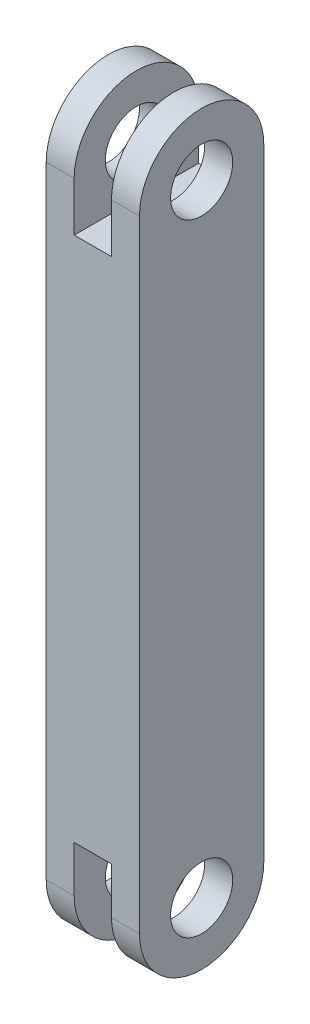
ISO-10303-21;
HEADER;
FILE_DESCRIPTION(('STEP AP214'),'2;1');
FILE_NAME('part.step','',(''),(''),'','','');
FILE_SCHEMA(('AUTOMOTIVE_DESIGN { 1 0 10303 214 1 1 1 1 }'));
ENDSEC;
DATA;
#1=APPLICATION_CONTEXT('core data for automotive mechanical design processes');
#2=APPLICATION_PROTOCOL_DEFINITION('international standard','automotive_design',2000,#1);
#3=PRODUCT_CONTEXT('',#1,'mechanical');
#4=PRODUCT('Part','Part','',(#3));
#5=PRODUCT_RELATED_PRODUCT_CATEGORY('part','',(#4));
#6=PRODUCT_DEFINITION_FORMATION('','',#4);
#7=PRODUCT_DEFINITION_CONTEXT('part definition',#1,'design');
#8=PRODUCT_DEFINITION('design','',#6,#7);
#9=PRODUCT_DEFINITION_SHAPE('','',#8);
#10=(LENGTH_UNIT() NAMED_UNIT(*) SI_UNIT(.MILLI.,.METRE.));
#11=(NAMED_UNIT(*) PLANE_ANGLE_UNIT() SI_UNIT($,.RADIAN.));
#12=(NAMED_UNIT(*) SI_UNIT($,.STERADIAN.) SOLID_ANGLE_UNIT());
#13=UNCERTAINTY_MEASURE_WITH_UNIT(LENGTH_MEASURE(1.E-05),#10,'distance_accuracy_value','');
#14=(GEOMETRIC_REPRESENTATION_CONTEXT(3) GLOBAL_UNCERTAINTY_ASSIGNED_CONTEXT((#13)) GLOBAL_UNIT_ASSIGNED_CONTEXT((#10,
#11,#12)) REPRESENTATION_CONTEXT('',''));
#15=CARTESIAN_POINT('',(0.,0.,0.));
#16=DIRECTION('',(0.,0.,1.));
#17=DIRECTION('',(1.,0.,0.));
#18=AXIS2_PLACEMENT_3D('',#15,#16,#17);
#19=CARTESIAN_POINT('',(9.525,0.,0.));
#20=DIRECTION('',(-1.,0.,0.));
#21=DIRECTION('',(0.,0.,1.));
#22=AXIS2_PLACEMENT_3D('',#19,#20,#21);
#23=CYLINDRICAL_SURFACE('',#22,12.7);
#24=DIRECTION('',(-1.,0.,0.));
#25=VECTOR('',#24,1.);
#26=CARTESIAN_POINT('',(9.525,0.,-12.7));
#27=LINE('',#26,#25);
#28=CARTESIAN_POINT('',(-3.80999999999998,0.,-12.7));
#29=VERTEX_POINT('',#28);
#30=CARTESIAN_POINT('',(-9.525,0.,-12.7));
#31=VERTEX_POINT('',#30);
#32=EDGE_CURVE('E214',#29,#31,#27,.T.);
#33=ORIENTED_EDGE('',*,*,#32,.F.);
#34=CARTESIAN_POINT('',(-3.80999999999998,0.,0.));
#35=DIRECTION('',(-1.,0.,0.));
#36=DIRECTION('',(0.,-1.,0.));
#37=AXIS2_PLACEMENT_3D('',#34,#35,#36);
#38=CIRCLE('',#37,12.7);
#39=CARTESIAN_POINT('',(-3.80999999999998,0.,12.7));
#40=VERTEX_POINT('',#39);
#41=EDGE_CURVE('E175',#29,#40,#38,.T.);
#42=ORIENTED_EDGE('',*,*,#41,.T.);
#43=DIRECTION('',(-1.,0.,0.));
#44=VECTOR('',#43,1.);
#45=CARTESIAN_POINT('',(9.525,0.,12.7));
#46=LINE('',#45,#44);
#47=CARTESIAN_POINT('',(-9.525,0.,12.7));
#48=VERTEX_POINT('',#47);
#49=EDGE_CURVE('E193',#40,#48,#46,.T.);
#50=ORIENTED_EDGE('',*,*,#49,.T.);
#51=CARTESIAN_POINT('',(-9.525,0.,0.));
#52=DIRECTION('',(1.,0.,0.));
#53=DIRECTION('',(0.,0.,-1.));
#54=AXIS2_PLACEMENT_3D('',#51,#52,#53);
#55=CIRCLE('',#54,12.7);
#56=EDGE_CURVE('E182',#48,#31,#55,.T.);
#57=ORIENTED_EDGE('',*,*,#56,.T.);
#58=EDGE_LOOP('',(#33,#42,#50,#57));
#59=FACE_BOUND('',#58,.T.);
#60=ADVANCED_FACE('F41',(#59),#23,.T.);
#61=CARTESIAN_POINT('',(9.525,127.,0.));
#62=DIRECTION('',(-1.,0.,0.));
#63=DIRECTION('',(0.,0.,1.));
#64=AXIS2_PLACEMENT_3D('',#61,#62,#63);
#65=CYLINDRICAL_SURFACE('',#64,12.7);
#66=DIRECTION('',(-1.,0.,0.));
#67=VECTOR('',#66,1.);
#68=CARTESIAN_POINT('',(9.525,127.,12.7));
#69=LINE('',#68,#67);
#70=CARTESIAN_POINT('',(-3.81,127.,12.7));
#71=VERTEX_POINT('',#70);
#72=CARTESIAN_POINT('',(-9.525,127.,12.7));
#73=VERTEX_POINT('',#72);
#74=EDGE_CURVE('E207',#71,#73,#69,.T.);
#75=ORIENTED_EDGE('',*,*,#74,.F.);
#76=CARTESIAN_POINT('',(-3.81,127.,0.));
#77=DIRECTION('',(-1.,0.,0.));
#78=DIRECTION('',(0.,0.,1.));
#79=AXIS2_PLACEMENT_3D('',#76,#77,#78);
#80=CIRCLE('',#79,12.7);
#81=CARTESIAN_POINT('',(-3.81,127.,-12.7));
#82=VERTEX_POINT('',#81);
#83=EDGE_CURVE('E179',#71,#82,#80,.T.);
#84=ORIENTED_EDGE('',*,*,#83,.T.);
#85=DIRECTION('',(-1.,0.,0.));
#86=VECTOR('',#85,1.);
#87=CARTESIAN_POINT('',(9.525,127.,-12.7));
#88=LINE('',#87,#86);
#89=CARTESIAN_POINT('',(-9.525,127.,-12.7));
#90=VERTEX_POINT('',#89);
#91=EDGE_CURVE('E211',#82,#90,#88,.T.);
#92=ORIENTED_EDGE('',*,*,#91,.T.);
#93=CARTESIAN_POINT('',(-9.525,127.,0.));
#94=DIRECTION('',(1.,0.,0.));
#95=DIRECTION('',(0.,0.,-1.));
#96=AXIS2_PLACEMENT_3D('',#93,#94,#95);
#97=CIRCLE('',#96,12.7);
#98=EDGE_CURVE('E199',#90,#73,#97,.T.);
#99=ORIENTED_EDGE('',*,*,#98,.T.);
#100=EDGE_LOOP('',(#75,#84,#92,#99));
#101=FACE_BOUND('',#100,.T.);
#102=ADVANCED_FACE('F271',(#101),#65,.T.);
#103=CARTESIAN_POINT('',(9.525,0.,12.7));
#104=VERTEX_POINT('',#103);
#105=CARTESIAN_POINT('',(3.81000000000002,0.,12.7));
#106=VERTEX_POINT('',#105);
#107=EDGE_CURVE('E204',#104,#106,#46,.T.);
#108=ORIENTED_EDGE('',*,*,#107,.T.);
#109=CARTESIAN_POINT('',(3.81000000000002,0.,0.));
#110=DIRECTION('',(1.,0.,0.));
#111=DIRECTION('',(0.,1.,0.));
#112=AXIS2_PLACEMENT_3D('',#109,#110,#111);
#113=CIRCLE('',#112,12.7);
#114=CARTESIAN_POINT('',(3.81000000000002,0.,-12.7));
#115=VERTEX_POINT('',#114);
#116=EDGE_CURVE('E66',#106,#115,#113,.T.);
#117=ORIENTED_EDGE('',*,*,#116,.T.);
#118=CARTESIAN_POINT('',(9.525,0.,-12.7));
#119=VERTEX_POINT('',#118);
#120=EDGE_CURVE('E215',#119,#115,#27,.T.);
#121=ORIENTED_EDGE('',*,*,#120,.F.);
#122=CARTESIAN_POINT('',(9.525,0.,0.));
#123=DIRECTION('',(1.,0.,0.));
#124=DIRECTION('',(0.,0.,-1.));
#125=AXIS2_PLACEMENT_3D('',#122,#123,#124);
#126=CIRCLE('',#125,12.7);
#127=EDGE_CURVE('E183',#104,#119,#126,.T.);
#128=ORIENTED_EDGE('',*,*,#127,.F.);
#129=EDGE_LOOP('',(#108,#117,#121,#128));
#130=FACE_BOUND('',#129,.T.);
#131=ADVANCED_FACE('F43',(#130),#23,.T.);
#132=CARTESIAN_POINT('',(9.525,0.,-12.7));
#133=DIRECTION('',(0.,0.,1.));
#134=DIRECTION('',(1.,0.,0.));
#135=AXIS2_PLACEMENT_3D('',#132,#133,#134);
#136=PLANE('',#135);
#137=ORIENTED_EDGE('',*,*,#91,.F.);
#138=DIRECTION('',(0.,-1.,0.));
#139=VECTOR('',#138,1.);
#140=CARTESIAN_POINT('',(-3.81,116.945260472718,-12.7));
#141=LINE('',#140,#139);
#142=CARTESIAN_POINT('',(-3.81,116.945260472718,-12.7));
#143=VERTEX_POINT('',#142);
#144=EDGE_CURVE('E139',#82,#143,#141,.T.);
#145=ORIENTED_EDGE('',*,*,#144,.T.);
#146=DIRECTION('',(1.,0.,0.));
#147=VECTOR('',#146,1.);
#148=CARTESIAN_POINT('',(3.81,116.945260472718,-12.7));
#149=LINE('',#148,#147);
#150=CARTESIAN_POINT('',(3.81,116.945260472718,-12.7));
#151=VERTEX_POINT('',#150);
#152=EDGE_CURVE('E134',#143,#151,#149,.T.);
#153=ORIENTED_EDGE('',*,*,#152,.T.);
#154=DIRECTION('',(0.,1.,0.));
#155=VECTOR('',#154,1.);
#156=CARTESIAN_POINT('',(3.81,147.087355687949,-12.7));
#157=LINE('',#156,#155);
#158=CARTESIAN_POINT('',(3.81,127.,-12.7));
#159=VERTEX_POINT('',#158);
#160=EDGE_CURVE('E142',#151,#159,#157,.T.);
#161=ORIENTED_EDGE('',*,*,#160,.T.);
#162=CARTESIAN_POINT('',(9.525,127.,-12.7));
#163=VERTEX_POINT('',#162);
#164=EDGE_CURVE('E212',#163,#159,#88,.T.);
#165=ORIENTED_EDGE('',*,*,#164,.F.);
#166=DIRECTION('',(0.,1.,0.));
#167=VECTOR('',#166,1.);
#168=CARTESIAN_POINT('',(9.525,0.,-12.7));
#169=LINE('',#168,#167);
#170=EDGE_CURVE('E186',#119,#163,#169,.T.);
#171=ORIENTED_EDGE('',*,*,#170,.F.);
#172=ORIENTED_EDGE('',*,*,#120,.T.);
#173=DIRECTION('',(0.,1.,0.));
#174=VECTOR('',#173,1.);
#175=CARTESIAN_POINT('',(3.81000000000002,9.46987362916911,-12.7));
#176=LINE('',#175,#174);
#177=CARTESIAN_POINT('',(3.81000000000002,9.46987362916911,-12.7));
#178=VERTEX_POINT('',#177);
#179=EDGE_CURVE('E152',#115,#178,#176,.T.);
#180=ORIENTED_EDGE('',*,*,#179,.T.);
#181=DIRECTION('',(-1.,0.,0.));
#182=VECTOR('',#181,1.);
#183=CARTESIAN_POINT('',(-3.80999999999998,9.46987362916911,-12.7));
#184=LINE('',#183,#182);
#185=CARTESIAN_POINT('',(-3.80999999999998,9.46987362916911,-12.7));
#186=VERTEX_POINT('',#185);
#187=EDGE_CURVE('E155',#178,#186,#184,.T.);
#188=ORIENTED_EDGE('',*,*,#187,.T.);
#189=DIRECTION('',(0.,-1.,0.));
#190=VECTOR('',#189,1.);
#191=CARTESIAN_POINT('',(-3.80999999999998,-20.6722215860618,-12.7));
#192=LINE('',#191,#190);
#193=EDGE_CURVE('E166',#186,#29,#192,.T.);
#194=ORIENTED_EDGE('',*,*,#193,.T.);
#195=ORIENTED_EDGE('',*,*,#32,.T.);
#196=DIRECTION('',(0.,1.,0.));
#197=VECTOR('',#196,1.);
#198=CARTESIAN_POINT('',(-9.525,0.,-12.7));
#199=LINE('',#198,#197);
#200=EDGE_CURVE('E196',#31,#90,#199,.T.);
#201=ORIENTED_EDGE('',*,*,#200,.T.);
#202=EDGE_LOOP('',(#137,#145,#153,#161,#165,#171,#172,#180,#188,#194,#195,#201));
#203=FACE_BOUND('',#202,.T.);
#204=ADVANCED_FACE('F151',(#203),#136,.F.);
#205=ORIENTED_EDGE('',*,*,#164,.T.);
#206=CARTESIAN_POINT('',(3.81,127.,0.));
#207=DIRECTION('',(1.,0.,0.));
#208=DIRECTION('',(0.,1.,0.));
#209=AXIS2_PLACEMENT_3D('',#206,#207,#208);
#210=CIRCLE('',#209,12.7);
#211=CARTESIAN_POINT('',(3.81,127.,12.7));
#212=VERTEX_POINT('',#211);
#213=EDGE_CURVE('E145',#159,#212,#210,.T.);
#214=ORIENTED_EDGE('',*,*,#213,.T.);
#215=CARTESIAN_POINT('',(9.525,127.,12.7));
#216=VERTEX_POINT('',#215);
#217=EDGE_CURVE('E208',#216,#212,#69,.T.);
#218=ORIENTED_EDGE('',*,*,#217,.F.);
#219=CARTESIAN_POINT('',(9.525,127.,0.));
#220=DIRECTION('',(1.,0.,0.));
#221=DIRECTION('',(0.,0.,-1.));
#222=AXIS2_PLACEMENT_3D('',#219,#220,#221);
#223=CIRCLE('',#222,12.7);
#224=EDGE_CURVE('E189',#163,#216,#223,.T.);
#225=ORIENTED_EDGE('',*,*,#224,.F.);
#226=EDGE_LOOP('',(#205,#214,#218,#225));
#227=FACE_BOUND('',#226,.T.);
#228=ADVANCED_FACE('F278',(#227),#65,.T.);
#229=CARTESIAN_POINT('',(9.525,0.,12.7));
#230=DIRECTION('',(0.,0.,-1.));
#231=DIRECTION('',(-1.,0.,0.));
#232=AXIS2_PLACEMENT_3D('',#229,#230,#231);
#233=PLANE('',#232);
#234=DIRECTION('',(-1.,0.,0.));
#235=VECTOR('',#234,1.);
#236=CARTESIAN_POINT('',(9.525,116.945260472718,12.7));
#237=LINE('',#236,#235);
#238=CARTESIAN_POINT('',(3.81,116.945260472718,12.7));
#239=VERTEX_POINT('',#238);
#240=CARTESIAN_POINT('',(-3.81,116.945260472718,12.7));
#241=VERTEX_POINT('',#240);
#242=EDGE_CURVE('E50',#239,#241,#237,.T.);
#243=ORIENTED_EDGE('',*,*,#242,.T.);
#244=DIRECTION('',(0.,1.,0.));
#245=VECTOR('',#244,1.);
#246=CARTESIAN_POINT('',(-3.81,0.,12.7));
#247=LINE('',#246,#245);
#248=EDGE_CURVE('E11',#241,#71,#247,.T.);
#249=ORIENTED_EDGE('',*,*,#248,.T.);
#250=ORIENTED_EDGE('',*,*,#74,.T.);
#251=DIRECTION('',(0.,-1.,0.));
#252=VECTOR('',#251,1.);
#253=CARTESIAN_POINT('',(-9.525,0.,12.7));
#254=LINE('',#253,#252);
#255=EDGE_CURVE('E187',#73,#48,#254,.T.);
#256=ORIENTED_EDGE('',*,*,#255,.T.);
#257=ORIENTED_EDGE('',*,*,#49,.F.);
#258=DIRECTION('',(0.,1.,0.));
#259=VECTOR('',#258,1.);
#260=CARTESIAN_POINT('',(-3.80999999999998,0.,12.7));
#261=LINE('',#260,#259);
#262=CARTESIAN_POINT('',(-3.80999999999998,9.46987362916911,12.7));
#263=VERTEX_POINT('',#262);
#264=EDGE_CURVE('E223',#40,#263,#261,.T.);
#265=ORIENTED_EDGE('',*,*,#264,.T.);
#266=DIRECTION('',(1.,0.,0.));
#267=VECTOR('',#266,1.);
#268=CARTESIAN_POINT('',(9.525,9.46987362916911,12.7));
#269=LINE('',#268,#267);
#270=CARTESIAN_POINT('',(3.81000000000002,9.46987362916911,12.7));
#271=VERTEX_POINT('',#270);
#272=EDGE_CURVE('E220',#263,#271,#269,.T.);
#273=ORIENTED_EDGE('',*,*,#272,.T.);
#274=DIRECTION('',(0.,-1.,0.));
#275=VECTOR('',#274,1.);
#276=CARTESIAN_POINT('',(3.81000000000002,0.,12.7));
#277=LINE('',#276,#275);
#278=EDGE_CURVE('E218',#271,#106,#277,.T.);
#279=ORIENTED_EDGE('',*,*,#278,.T.);
#280=ORIENTED_EDGE('',*,*,#107,.F.);
#281=DIRECTION('',(0.,-1.,0.));
#282=VECTOR('',#281,1.);
#283=CARTESIAN_POINT('',(9.525,0.,12.7));
#284=LINE('',#283,#282);
#285=EDGE_CURVE('E191',#216,#104,#284,.T.);
#286=ORIENTED_EDGE('',*,*,#285,.F.);
#287=ORIENTED_EDGE('',*,*,#217,.T.);
#288=DIRECTION('',(0.,-1.,0.));
#289=VECTOR('',#288,1.);
#290=CARTESIAN_POINT('',(3.81,0.,12.7));
#291=LINE('',#290,#289);
#292=EDGE_CURVE('E226',#212,#239,#291,.T.);
#293=ORIENTED_EDGE('',*,*,#292,.T.);
#294=EDGE_LOOP('',(#243,#249,#250,#256,#257,#265,#273,#279,#280,#286,#287,#293));
#295=FACE_BOUND('',#294,.T.);
#296=ADVANCED_FACE('F290',(#295),#233,.F.);
#297=CARTESIAN_POINT('',(9.525,0.,0.));
#298=DIRECTION('',(1.,0.,0.));
#299=DIRECTION('',(0.,0.,-1.));
#300=AXIS2_PLACEMENT_3D('',#297,#298,#299);
#301=PLANE('',#300);
#302=CARTESIAN_POINT('',(9.525,0.,0.));
#303=DIRECTION('',(1.,0.,0.));
#304=DIRECTION('',(0.,0.,-1.));
#305=AXIS2_PLACEMENT_3D('',#302,#303,#304);
#306=CIRCLE('',#305,6.35);
#307=CARTESIAN_POINT('',(9.525,0.,-6.35));
#308=VERTEX_POINT('',#307);
#309=EDGE_CURVE('E158',#308,#308,#306,.T.);
#310=ORIENTED_EDGE('',*,*,#309,.F.);
#311=EDGE_LOOP('',(#310));
#312=FACE_BOUND('',#311,.T.);
#313=CARTESIAN_POINT('',(9.525,127.,0.));
#314=DIRECTION('',(1.,0.,0.));
#315=DIRECTION('',(0.,0.,-1.));
#316=AXIS2_PLACEMENT_3D('',#313,#314,#315);
#317=CIRCLE('',#316,6.35);
#318=CARTESIAN_POINT('',(9.525,127.,-6.35));
#319=VERTEX_POINT('',#318);
#320=EDGE_CURVE('E235',#319,#319,#317,.T.);
#321=ORIENTED_EDGE('',*,*,#320,.F.);
#322=EDGE_LOOP('',(#321));
#323=FACE_BOUND('',#322,.T.);
#324=ORIENTED_EDGE('',*,*,#127,.T.);
#325=ORIENTED_EDGE('',*,*,#170,.T.);
#326=ORIENTED_EDGE('',*,*,#224,.T.);
#327=ORIENTED_EDGE('',*,*,#285,.T.);
#328=EDGE_LOOP('',(#324,#325,#326,#327));
#329=FACE_BOUND('',#328,.T.);
#330=ADVANCED_FACE('F297',(#312,#323,#329),#301,.T.);
#331=CARTESIAN_POINT('',(-9.525,0.,0.));
#332=DIRECTION('',(1.,0.,0.));
#333=DIRECTION('',(0.,0.,-1.));
#334=AXIS2_PLACEMENT_3D('',#331,#332,#333);
#335=PLANE('',#334);
#336=CARTESIAN_POINT('',(-9.525,0.,0.));
#337=DIRECTION('',(1.,0.,0.));
#338=DIRECTION('',(0.,0.,-1.));
#339=AXIS2_PLACEMENT_3D('',#336,#337,#338);
#340=CIRCLE('',#339,6.35);
#341=CARTESIAN_POINT('',(-9.525,0.,-6.35));
#342=VERTEX_POINT('',#341);
#343=EDGE_CURVE('E231',#342,#342,#340,.T.);
#344=ORIENTED_EDGE('',*,*,#343,.T.);
#345=EDGE_LOOP('',(#344));
#346=FACE_BOUND('',#345,.T.);
#347=CARTESIAN_POINT('',(-9.525,127.,0.));
#348=DIRECTION('',(1.,0.,0.));
#349=DIRECTION('',(0.,0.,-1.));
#350=AXIS2_PLACEMENT_3D('',#347,#348,#349);
#351=CIRCLE('',#350,6.35);
#352=CARTESIAN_POINT('',(-9.525,127.,-6.35));
#353=VERTEX_POINT('',#352);
#354=EDGE_CURVE('E238',#353,#353,#351,.T.);
#355=ORIENTED_EDGE('',*,*,#354,.T.);
#356=EDGE_LOOP('',(#355));
#357=FACE_BOUND('',#356,.T.);
#358=ORIENTED_EDGE('',*,*,#56,.F.);
#359=ORIENTED_EDGE('',*,*,#255,.F.);
#360=ORIENTED_EDGE('',*,*,#98,.F.);
#361=ORIENTED_EDGE('',*,*,#200,.F.);
#362=EDGE_LOOP('',(#358,#359,#360,#361));
#363=FACE_BOUND('',#362,.T.);
#364=ADVANCED_FACE('F307',(#346,#357,#363),#335,.F.);
#365=CARTESIAN_POINT('',(-3.80999999999998,-20.6722215860618,-12.7));
#366=DIRECTION('',(-1.,0.,0.));
#367=DIRECTION('',(0.,-1.,0.));
#368=AXIS2_PLACEMENT_3D('',#365,#366,#367);
#369=PLANE('',#368);
#370=CARTESIAN_POINT('',(-3.80999999999998,0.,0.));
#371=DIRECTION('',(-1.,0.,0.));
#372=DIRECTION('',(0.,-1.,0.));
#373=AXIS2_PLACEMENT_3D('',#370,#371,#372);
#374=CIRCLE('',#373,6.35);
#375=CARTESIAN_POINT('',(-3.80999999999998,0.,-6.35));
#376=VERTEX_POINT('',#375);
#377=EDGE_CURVE('E246',#376,#376,#374,.T.);
#378=ORIENTED_EDGE('',*,*,#377,.T.);
#379=EDGE_LOOP('',(#378));
#380=FACE_BOUND('',#379,.T.);
#381=ORIENTED_EDGE('',*,*,#193,.F.);
#382=DIRECTION('',(0.,0.,1.));
#383=VECTOR('',#382,1.);
#384=CARTESIAN_POINT('',(-3.80999999999998,9.46987362916911,-12.7));
#385=LINE('',#384,#383);
#386=EDGE_CURVE('E167',#186,#263,#385,.T.);
#387=ORIENTED_EDGE('',*,*,#386,.T.);
#388=ORIENTED_EDGE('',*,*,#264,.F.);
#389=ORIENTED_EDGE('',*,*,#41,.F.);
#390=EDGE_LOOP('',(#381,#387,#388,#389));
#391=FACE_BOUND('',#390,.T.);
#392=ADVANCED_FACE('F310',(#380,#391),#369,.F.);
#393=CARTESIAN_POINT('',(-3.80999999999998,9.46987362916911,-12.7));
#394=DIRECTION('',(0.,1.,0.));
#395=DIRECTION('',(0.,0.,1.));
#396=AXIS2_PLACEMENT_3D('',#393,#394,#395);
#397=PLANE('',#396);
#398=ORIENTED_EDGE('',*,*,#386,.F.);
#399=ORIENTED_EDGE('',*,*,#187,.F.);
#400=DIRECTION('',(0.,0.,1.));
#401=VECTOR('',#400,1.);
#402=CARTESIAN_POINT('',(3.81000000000002,9.46987362916911,-12.7));
#403=LINE('',#402,#401);
#404=EDGE_CURVE('E163',#178,#271,#403,.T.);
#405=ORIENTED_EDGE('',*,*,#404,.T.);
#406=ORIENTED_EDGE('',*,*,#272,.F.);
#407=EDGE_LOOP('',(#398,#399,#405,#406));
#408=FACE_BOUND('',#407,.T.);
#409=ADVANCED_FACE('F293',(#408),#397,.F.);
#410=CARTESIAN_POINT('',(3.81000000000002,9.46987362916911,-12.7));
#411=DIRECTION('',(1.,0.,0.));
#412=DIRECTION('',(0.,1.,0.));
#413=AXIS2_PLACEMENT_3D('',#410,#411,#412);
#414=PLANE('',#413);
#415=CARTESIAN_POINT('',(3.81000000000002,0.,0.));
#416=DIRECTION('',(1.,0.,0.));
#417=DIRECTION('',(0.,1.,0.));
#418=AXIS2_PLACEMENT_3D('',#415,#416,#417);
#419=CIRCLE('',#418,6.35);
#420=CARTESIAN_POINT('',(3.81000000000002,0.,-6.35));
#421=VERTEX_POINT('',#420);
#422=EDGE_CURVE('E45',#421,#421,#419,.T.);
#423=ORIENTED_EDGE('',*,*,#422,.T.);
#424=EDGE_LOOP('',(#423));
#425=FACE_BOUND('',#424,.T.);
#426=ORIENTED_EDGE('',*,*,#278,.F.);
#427=ORIENTED_EDGE('',*,*,#404,.F.);
#428=ORIENTED_EDGE('',*,*,#179,.F.);
#429=ORIENTED_EDGE('',*,*,#116,.F.);
#430=EDGE_LOOP('',(#426,#427,#428,#429));
#431=FACE_BOUND('',#430,.T.);
#432=ADVANCED_FACE('F254',(#425,#431),#414,.F.);
#433=CARTESIAN_POINT('',(3.81,116.945260472718,-12.7));
#434=DIRECTION('',(0.,-1.,0.));
#435=DIRECTION('',(0.,0.,-1.));
#436=AXIS2_PLACEMENT_3D('',#433,#434,#435);
#437=PLANE('',#436);
#438=DIRECTION('',(0.,0.,1.));
#439=VECTOR('',#438,1.);
#440=CARTESIAN_POINT('',(3.81,116.945260472718,-12.7));
#441=LINE('',#440,#439);
#442=EDGE_CURVE('E58',#151,#239,#441,.T.);
#443=ORIENTED_EDGE('',*,*,#442,.F.);
#444=ORIENTED_EDGE('',*,*,#152,.F.);
#445=DIRECTION('',(0.,0.,1.));
#446=VECTOR('',#445,1.);
#447=CARTESIAN_POINT('',(-3.81,116.945260472718,-12.7));
#448=LINE('',#447,#446);
#449=EDGE_CURVE('E138',#143,#241,#448,.T.);
#450=ORIENTED_EDGE('',*,*,#449,.T.);
#451=ORIENTED_EDGE('',*,*,#242,.F.);
#452=EDGE_LOOP('',(#443,#444,#450,#451));
#453=FACE_BOUND('',#452,.T.);
#454=ADVANCED_FACE('F131',(#453),#437,.F.);
#455=CARTESIAN_POINT('',(-3.81,116.945260472718,-12.7));
#456=DIRECTION('',(-1.,0.,0.));
#457=DIRECTION('',(0.,0.,1.));
#458=AXIS2_PLACEMENT_3D('',#455,#456,#457);
#459=PLANE('',#458);
#460=CARTESIAN_POINT('',(-3.81,127.,0.));
#461=DIRECTION('',(-1.,0.,0.));
#462=DIRECTION('',(0.,0.,1.));
#463=AXIS2_PLACEMENT_3D('',#460,#461,#462);
#464=CIRCLE('',#463,6.35);
#465=CARTESIAN_POINT('',(-3.81,127.,-6.35));
#466=VERTEX_POINT('',#465);
#467=EDGE_CURVE('E230',#466,#466,#464,.T.);
#468=ORIENTED_EDGE('',*,*,#467,.T.);
#469=EDGE_LOOP('',(#468));
#470=FACE_BOUND('',#469,.T.);
#471=ORIENTED_EDGE('',*,*,#248,.F.);
#472=ORIENTED_EDGE('',*,*,#449,.F.);
#473=ORIENTED_EDGE('',*,*,#144,.F.);
#474=ORIENTED_EDGE('',*,*,#83,.F.);
#475=EDGE_LOOP('',(#471,#472,#473,#474));
#476=FACE_BOUND('',#475,.T.);
#477=ADVANCED_FACE('F349',(#470,#476),#459,.F.);
#478=CARTESIAN_POINT('',(3.81,147.087355687949,-12.7));
#479=DIRECTION('',(1.,0.,0.));
#480=DIRECTION('',(0.,1.,0.));
#481=AXIS2_PLACEMENT_3D('',#478,#479,#480);
#482=PLANE('',#481);
#483=CARTESIAN_POINT('',(3.81,127.,0.));
#484=DIRECTION('',(1.,0.,0.));
#485=DIRECTION('',(0.,1.,0.));
#486=AXIS2_PLACEMENT_3D('',#483,#484,#485);
#487=CIRCLE('',#486,6.35);
#488=CARTESIAN_POINT('',(3.81,127.,-6.35));
#489=VERTEX_POINT('',#488);
#490=EDGE_CURVE('E228',#489,#489,#487,.T.);
#491=ORIENTED_EDGE('',*,*,#490,.T.);
#492=EDGE_LOOP('',(#491));
#493=FACE_BOUND('',#492,.T.);
#494=ORIENTED_EDGE('',*,*,#160,.F.);
#495=ORIENTED_EDGE('',*,*,#442,.T.);
#496=ORIENTED_EDGE('',*,*,#292,.F.);
#497=ORIENTED_EDGE('',*,*,#213,.F.);
#498=EDGE_LOOP('',(#494,#495,#496,#497));
#499=FACE_BOUND('',#498,.T.);
#500=ADVANCED_FACE('F143',(#493,#499),#482,.F.);
#501=CARTESIAN_POINT('',(-9.525,127.,0.));
#502=DIRECTION('',(1.,0.,0.));
#503=DIRECTION('',(0.,0.,-1.));
#504=AXIS2_PLACEMENT_3D('',#501,#502,#503);
#505=CYLINDRICAL_SURFACE('',#504,6.35);
#506=CARTESIAN_POINT('',(9.525,127.,-6.35));
#507=CARTESIAN_POINT('',(9.46546875,127.,-6.35));
#508=CARTESIAN_POINT('',(9.4059375,127.,-6.35));
#509=CARTESIAN_POINT('',(9.286875,127.,-6.35));
#510=CARTESIAN_POINT('',(9.22734375,127.,-6.35));
#511=CARTESIAN_POINT('',(9.10828125,127.,-6.35));
#512=CARTESIAN_POINT('',(9.04875,127.,-6.35));
#513=CARTESIAN_POINT('',(8.9296875,127.,-6.35));
#514=CARTESIAN_POINT('',(8.87015625,127.,-6.35));
#515=CARTESIAN_POINT('',(8.75109375,127.,-6.35));
#516=CARTESIAN_POINT('',(8.6915625,127.,-6.35));
#517=CARTESIAN_POINT('',(8.5725,127.,-6.35));
#518=CARTESIAN_POINT('',(8.51296875,127.,-6.35));
#519=CARTESIAN_POINT('',(8.39390625,127.,-6.35));
#520=CARTESIAN_POINT('',(8.334375,127.,-6.35));
#521=CARTESIAN_POINT('',(8.2153125,127.,-6.35));
#522=CARTESIAN_POINT('',(8.15578125,127.,-6.35));
#523=CARTESIAN_POINT('',(8.03671875,127.,-6.35));
#524=CARTESIAN_POINT('',(7.9771875,127.,-6.35));
#525=CARTESIAN_POINT('',(7.858125,127.,-6.35));
#526=CARTESIAN_POINT('',(7.79859375,127.,-6.35));
#527=CARTESIAN_POINT('',(7.67953125,127.,-6.35));
#528=CARTESIAN_POINT('',(7.62,127.,-6.35));
#529=CARTESIAN_POINT('',(7.5009375,127.,-6.35));
#530=CARTESIAN_POINT('',(7.44140625,127.,-6.35));
#531=CARTESIAN_POINT('',(7.32234375,127.,-6.35));
#532=CARTESIAN_POINT('',(7.2628125,127.,-6.35));
#533=CARTESIAN_POINT('',(7.14375,127.,-6.35));
#534=CARTESIAN_POINT('',(7.08421875,127.,-6.35));
#535=CARTESIAN_POINT('',(6.96515625,127.,-6.35));
#536=CARTESIAN_POINT('',(6.905625,127.,-6.35));
#537=CARTESIAN_POINT('',(6.7865625,127.,-6.35));
#538=CARTESIAN_POINT('',(6.72703125,127.,-6.35));
#539=CARTESIAN_POINT('',(6.60796875,127.,-6.35));
#540=CARTESIAN_POINT('',(6.5484375,127.,-6.35));
#541=CARTESIAN_POINT('',(6.429375,127.,-6.35));
#542=CARTESIAN_POINT('',(6.36984375,127.,-6.35));
#543=CARTESIAN_POINT('',(6.25078125,127.,-6.35));
#544=CARTESIAN_POINT('',(6.19125,127.,-6.35));
#545=CARTESIAN_POINT('',(6.0721875,127.,-6.35));
#546=CARTESIAN_POINT('',(6.01265625,127.,-6.35));
#547=CARTESIAN_POINT('',(5.89359375,127.,-6.35));
#548=CARTESIAN_POINT('',(5.8340625,127.,-6.35));
#549=CARTESIAN_POINT('',(5.715,127.,-6.35));
#550=CARTESIAN_POINT('',(5.65546875,127.,-6.35));
#551=CARTESIAN_POINT('',(5.53640625,127.,-6.35));
#552=CARTESIAN_POINT('',(5.476875,127.,-6.35));
#553=CARTESIAN_POINT('',(5.3578125,127.,-6.35));
#554=CARTESIAN_POINT('',(5.29828125,127.,-6.35));
#555=CARTESIAN_POINT('',(5.17921875,127.,-6.35));
#556=CARTESIAN_POINT('',(5.1196875,127.,-6.35));
#557=CARTESIAN_POINT('',(5.000625,127.,-6.35));
#558=CARTESIAN_POINT('',(4.94109375,127.,-6.35));
#559=CARTESIAN_POINT('',(4.82203125,127.,-6.35));
#560=CARTESIAN_POINT('',(4.7625,127.,-6.35));
#561=CARTESIAN_POINT('',(4.6434375,127.,-6.35));
#562=CARTESIAN_POINT('',(4.58390625,127.,-6.35));
#563=CARTESIAN_POINT('',(4.46484375,127.,-6.35));
#564=CARTESIAN_POINT('',(4.4053125,127.,-6.35));
#565=CARTESIAN_POINT('',(4.28625,127.,-6.35));
#566=CARTESIAN_POINT('',(4.22671875,127.,-6.35));
#567=CARTESIAN_POINT('',(4.10765625,127.,-6.35));
#568=CARTESIAN_POINT('',(4.048125,127.,-6.35));
#569=CARTESIAN_POINT('',(3.9290625,127.,-6.35));
#570=CARTESIAN_POINT('',(3.86953125,127.,-6.35));
#571=CARTESIAN_POINT('',(3.81,127.,-6.35));
#572=B_SPLINE_CURVE_WITH_KNOTS('',3,(#506,#507,#508,#509,#510,#511,#512,#513,#514,#515,#516,
#517,#518,#519,#520,#521,#522,#523,#524,#525,#526,#527,#528,#529,#530,#531,#532,#533,#534,#535,
#536,#537,#538,#539,#540,#541,#542,#543,#544,#545,#546,#547,#548,#549,#550,#551,#552,#553,#554,
#555,#556,#557,#558,#559,#560,#561,#562,#563,#564,#565,#566,#567,#568,#569,#570,#571),
.UNSPECIFIED.,.F.,.F.,(4,2,2,2,2,2,2,2,2,2,2,2,2,2,2,2,2,2,2,2,2,2,2,2,2,2,2,2,2,2,2,2,4),(0.,
0.178593750000001,0.357187500000002,0.535781249999999,0.714375,0.892968750000001,1.0715625,
1.25015625,1.42875,1.60734375,1.7859375,1.96453125,2.143125,2.32171875,2.5003125,2.67890625,
2.8575,3.03609375,3.2146875,3.39328125,3.571875,3.75046875,3.9290625,4.10765625,4.28625,
4.46484375,4.6434375,4.82203125,5.000625,5.17921875,5.3578125,5.53640625,5.715),.UNSPECIFIED.);
#573=EDGE_CURVE('BSEAM267',#319,#489,#572,.T.);
#574=ORIENTED_EDGE('',*,*,#320,.T.);
#575=ORIENTED_EDGE('',*,*,#490,.F.);
#576=ORIENTED_EDGE('',*,*,#573,.T.);
#577=ORIENTED_EDGE('',*,*,#573,.F.);
#578=EDGE_LOOP('',(#574,#576,#575,#577));
#579=FACE_BOUND('',#578,.T.);
#580=ADVANCED_FACE('F267',(#579),#505,.F.);
#581=CARTESIAN_POINT('',(-9.525,127.,-6.35));
#582=CARTESIAN_POINT('',(-9.46546875,127.,-6.35));
#583=CARTESIAN_POINT('',(-9.4059375,127.,-6.35));
#584=CARTESIAN_POINT('',(-9.286875,127.,-6.35));
#585=CARTESIAN_POINT('',(-9.22734375,127.,-6.35));
#586=CARTESIAN_POINT('',(-9.10828125,127.,-6.35));
#587=CARTESIAN_POINT('',(-9.04875,127.,-6.35));
#588=CARTESIAN_POINT('',(-8.9296875,127.,-6.35));
#589=CARTESIAN_POINT('',(-8.87015625,127.,-6.35));
#590=CARTESIAN_POINT('',(-8.75109375,127.,-6.35));
#591=CARTESIAN_POINT('',(-8.6915625,127.,-6.35));
#592=CARTESIAN_POINT('',(-8.5725,127.,-6.35));
#593=CARTESIAN_POINT('',(-8.51296875,127.,-6.35));
#594=CARTESIAN_POINT('',(-8.39390625,127.,-6.35));
#595=CARTESIAN_POINT('',(-8.334375,127.,-6.35));
#596=CARTESIAN_POINT('',(-8.2153125,127.,-6.35));
#597=CARTESIAN_POINT('',(-8.15578125,127.,-6.35));
#598=CARTESIAN_POINT('',(-8.03671875,127.,-6.35));
#599=CARTESIAN_POINT('',(-7.9771875,127.,-6.35));
#600=CARTESIAN_POINT('',(-7.858125,127.,-6.35));
#601=CARTESIAN_POINT('',(-7.79859375,127.,-6.35));
#602=CARTESIAN_POINT('',(-7.67953125,127.,-6.35));
#603=CARTESIAN_POINT('',(-7.62,127.,-6.35));
#604=CARTESIAN_POINT('',(-7.5009375,127.,-6.35));
#605=CARTESIAN_POINT('',(-7.44140625,127.,-6.35));
#606=CARTESIAN_POINT('',(-7.32234375,127.,-6.35));
#607=CARTESIAN_POINT('',(-7.2628125,127.,-6.35));
#608=CARTESIAN_POINT('',(-7.14375,127.,-6.35));
#609=CARTESIAN_POINT('',(-7.08421875,127.,-6.35));
#610=CARTESIAN_POINT('',(-6.96515625,127.,-6.35));
#611=CARTESIAN_POINT('',(-6.905625,127.,-6.35));
#612=CARTESIAN_POINT('',(-6.7865625,127.,-6.35));
#613=CARTESIAN_POINT('',(-6.72703125,127.,-6.35));
#614=CARTESIAN_POINT('',(-6.60796875,127.,-6.35));
#615=CARTESIAN_POINT('',(-6.5484375,127.,-6.35));
#616=CARTESIAN_POINT('',(-6.429375,127.,-6.35));
#617=CARTESIAN_POINT('',(-6.36984375,127.,-6.35));
#618=CARTESIAN_POINT('',(-6.25078125,127.,-6.35));
#619=CARTESIAN_POINT('',(-6.19125,127.,-6.35));
#620=CARTESIAN_POINT('',(-6.0721875,127.,-6.35));
#621=CARTESIAN_POINT('',(-6.01265625,127.,-6.35));
#622=CARTESIAN_POINT('',(-5.89359375,127.,-6.35));
#623=CARTESIAN_POINT('',(-5.8340625,127.,-6.35));
#624=CARTESIAN_POINT('',(-5.715,127.,-6.35));
#625=CARTESIAN_POINT('',(-5.65546875,127.,-6.35));
#626=CARTESIAN_POINT('',(-5.53640625,127.,-6.35));
#627=CARTESIAN_POINT('',(-5.476875,127.,-6.35));
#628=CARTESIAN_POINT('',(-5.3578125,127.,-6.35));
#629=CARTESIAN_POINT('',(-5.29828125,127.,-6.35));
#630=CARTESIAN_POINT('',(-5.17921875,127.,-6.35));
#631=CARTESIAN_POINT('',(-5.1196875,127.,-6.35));
#632=CARTESIAN_POINT('',(-5.000625,127.,-6.35));
#633=CARTESIAN_POINT('',(-4.94109375,127.,-6.35));
#634=CARTESIAN_POINT('',(-4.82203125,127.,-6.35));
#635=CARTESIAN_POINT('',(-4.7625,127.,-6.35));
#636=CARTESIAN_POINT('',(-4.6434375,127.,-6.35));
#637=CARTESIAN_POINT('',(-4.58390625,127.,-6.35));
#638=CARTESIAN_POINT('',(-4.46484375,127.,-6.35));
#639=CARTESIAN_POINT('',(-4.4053125,127.,-6.35));
#640=CARTESIAN_POINT('',(-4.28625,127.,-6.35));
#641=CARTESIAN_POINT('',(-4.22671875,127.,-6.35));
#642=CARTESIAN_POINT('',(-4.10765625,127.,-6.35));
#643=CARTESIAN_POINT('',(-4.048125,127.,-6.35));
#644=CARTESIAN_POINT('',(-3.9290625,127.,-6.35));
#645=CARTESIAN_POINT('',(-3.86953125,127.,-6.35));
#646=CARTESIAN_POINT('',(-3.81,127.,-6.35));
#647=B_SPLINE_CURVE_WITH_KNOTS('',3,(#581,#582,#583,#584,#585,#586,#587,#588,#589,#590,#591,
#592,#593,#594,#595,#596,#597,#598,#599,#600,#601,#602,#603,#604,#605,#606,#607,#608,#609,#610,
#611,#612,#613,#614,#615,#616,#617,#618,#619,#620,#621,#622,#623,#624,#625,#626,#627,#628,#629,
#630,#631,#632,#633,#634,#635,#636,#637,#638,#639,#640,#641,#642,#643,#644,#645,#646),
.UNSPECIFIED.,.F.,.F.,(4,2,2,2,2,2,2,2,2,2,2,2,2,2,2,2,2,2,2,2,2,2,2,2,2,2,2,2,2,2,2,2,4),(0.,
0.178593750000001,0.357187500000002,0.535781250000001,0.714375000000001,0.892968750000002,
1.0715625,1.25015625,1.42875,1.60734375,1.7859375,1.96453125,2.143125,2.32171875,2.5003125,
2.67890625,2.8575,3.03609375,3.2146875,3.39328125,3.571875,3.75046875,3.9290625,4.10765625,
4.28625,4.46484375,4.6434375,4.82203125000001,5.000625,5.17921875,5.3578125,5.53640625000001,
5.71500000000001),.UNSPECIFIED.);
#648=EDGE_CURVE('BSEAM259',#353,#466,#647,.T.);
#649=ORIENTED_EDGE('',*,*,#354,.F.);
#650=ORIENTED_EDGE('',*,*,#467,.F.);
#651=ORIENTED_EDGE('',*,*,#648,.T.);
#652=ORIENTED_EDGE('',*,*,#648,.F.);
#653=EDGE_LOOP('',(#649,#651,#650,#652));
#654=FACE_BOUND('',#653,.T.);
#655=ADVANCED_FACE('F259',(#654),#505,.F.);
#656=CARTESIAN_POINT('',(-9.525,0.,0.));
#657=DIRECTION('',(1.,0.,0.));
#658=DIRECTION('',(0.,0.,-1.));
#659=AXIS2_PLACEMENT_3D('',#656,#657,#658);
#660=CYLINDRICAL_SURFACE('',#659,6.35);
#661=CARTESIAN_POINT('',(9.525,0.,-6.35));
#662=CARTESIAN_POINT('',(9.46546875,0.,-6.35));
#663=CARTESIAN_POINT('',(9.4059375,0.,-6.35));
#664=CARTESIAN_POINT('',(9.286875,0.,-6.35));
#665=CARTESIAN_POINT('',(9.22734375,0.,-6.35));
#666=CARTESIAN_POINT('',(9.10828125,0.,-6.35));
#667=CARTESIAN_POINT('',(9.04875,0.,-6.35));
#668=CARTESIAN_POINT('',(8.9296875,0.,-6.35));
#669=CARTESIAN_POINT('',(8.87015625,0.,-6.35));
#670=CARTESIAN_POINT('',(8.75109375,0.,-6.35));
#671=CARTESIAN_POINT('',(8.6915625,0.,-6.35));
#672=CARTESIAN_POINT('',(8.5725,0.,-6.35));
#673=CARTESIAN_POINT('',(8.51296875,0.,-6.35));
#674=CARTESIAN_POINT('',(8.39390625,0.,-6.35));
#675=CARTESIAN_POINT('',(8.334375,0.,-6.35));
#676=CARTESIAN_POINT('',(8.2153125,0.,-6.35));
#677=CARTESIAN_POINT('',(8.15578125,0.,-6.35));
#678=CARTESIAN_POINT('',(8.03671875000001,0.,-6.35));
#679=CARTESIAN_POINT('',(7.9771875,0.,-6.35));
#680=CARTESIAN_POINT('',(7.858125,0.,-6.35));
#681=CARTESIAN_POINT('',(7.79859375000001,0.,-6.35));
#682=CARTESIAN_POINT('',(7.67953125000001,0.,-6.35));
#683=CARTESIAN_POINT('',(7.62000000000001,0.,-6.35));
#684=CARTESIAN_POINT('',(7.50093750000001,0.,-6.35));
#685=CARTESIAN_POINT('',(7.44140625000001,0.,-6.35));
#686=CARTESIAN_POINT('',(7.32234375000001,0.,-6.35));
#687=CARTESIAN_POINT('',(7.26281250000001,0.,-6.35));
#688=CARTESIAN_POINT('',(7.14375000000001,0.,-6.35));
#689=CARTESIAN_POINT('',(7.08421875000001,0.,-6.35));
#690=CARTESIAN_POINT('',(6.96515625000001,0.,-6.35));
#691=CARTESIAN_POINT('',(6.90562500000001,0.,-6.35));
#692=CARTESIAN_POINT('',(6.78656250000001,0.,-6.35));
#693=CARTESIAN_POINT('',(6.72703125000001,0.,-6.35));
#694=CARTESIAN_POINT('',(6.60796875000001,0.,-6.35));
#695=CARTESIAN_POINT('',(6.54843750000001,0.,-6.35));
#696=CARTESIAN_POINT('',(6.42937500000001,0.,-6.35));
#697=CARTESIAN_POINT('',(6.36984375000001,0.,-6.35));
#698=CARTESIAN_POINT('',(6.25078125000001,0.,-6.35));
#699=CARTESIAN_POINT('',(6.19125000000001,0.,-6.35));
#700=CARTESIAN_POINT('',(6.07218750000001,0.,-6.35));
#701=CARTESIAN_POINT('',(6.01265625000001,0.,-6.35));
#702=CARTESIAN_POINT('',(5.89359375000001,0.,-6.35));
#703=CARTESIAN_POINT('',(5.83406250000001,0.,-6.35));
#704=CARTESIAN_POINT('',(5.71500000000001,0.,-6.35));
#705=CARTESIAN_POINT('',(5.65546875000001,0.,-6.35));
#706=CARTESIAN_POINT('',(5.53640625000001,0.,-6.35));
#707=CARTESIAN_POINT('',(5.47687500000001,0.,-6.35));
#708=CARTESIAN_POINT('',(5.35781250000001,0.,-6.35));
#709=CARTESIAN_POINT('',(5.29828125000001,0.,-6.35));
#710=CARTESIAN_POINT('',(5.17921875000001,0.,-6.35));
#711=CARTESIAN_POINT('',(5.11968750000001,0.,-6.35));
#712=CARTESIAN_POINT('',(5.00062500000002,0.,-6.35));
#713=CARTESIAN_POINT('',(4.94109375000002,0.,-6.35));
#714=CARTESIAN_POINT('',(4.82203125000002,0.,-6.35));
#715=CARTESIAN_POINT('',(4.76250000000002,0.,-6.35));
#716=CARTESIAN_POINT('',(4.64343750000002,0.,-6.35));
#717=CARTESIAN_POINT('',(4.58390625000002,0.,-6.35));
#718=CARTESIAN_POINT('',(4.46484375000002,0.,-6.35));
#719=CARTESIAN_POINT('',(4.40531250000002,0.,-6.35));
#720=CARTESIAN_POINT('',(4.28625000000002,0.,-6.35));
#721=CARTESIAN_POINT('',(4.22671875000002,0.,-6.35));
#722=CARTESIAN_POINT('',(4.10765625000002,0.,-6.35));
#723=CARTESIAN_POINT('',(4.04812500000002,0.,-6.35));
#724=CARTESIAN_POINT('',(3.92906250000002,0.,-6.35));
#725=CARTESIAN_POINT('',(3.86953125000002,0.,-6.35));
#726=CARTESIAN_POINT('',(3.81000000000002,0.,-6.35));
#727=B_SPLINE_CURVE_WITH_KNOTS('',3,(#661,#662,#663,#664,#665,#666,#667,#668,#669,#670,#671,
#672,#673,#674,#675,#676,#677,#678,#679,#680,#681,#682,#683,#684,#685,#686,#687,#688,#689,#690,
#691,#692,#693,#694,#695,#696,#697,#698,#699,#700,#701,#702,#703,#704,#705,#706,#707,#708,#709,
#710,#711,#712,#713,#714,#715,#716,#717,#718,#719,#720,#721,#722,#723,#724,#725,#726),
.UNSPECIFIED.,.F.,.F.,(4,2,2,2,2,2,2,2,2,2,2,2,2,2,2,2,2,2,2,2,2,2,2,2,2,2,2,2,2,2,2,2,4),(0.,
0.178593750000001,0.357187499999998,0.535781249999999,0.714374999999996,0.892968749999997,
1.0715625,1.25015625,1.42875,1.60734375,1.78593749999999,1.96453124999999,2.143125,
2.32171874999999,2.50031249999999,2.67890624999999,2.85749999999999,3.03609374999999,
3.21468749999999,3.39328124999999,3.57187499999999,3.75046874999999,3.92906249999999,
4.10765624999999,4.28624999999999,4.46484374999998,4.64343749999998,4.82203124999999,
5.00062499999998,5.17921874999998,5.35781249999998,5.53640624999998,5.71499999999998),.UNSPECIFIED.);
#728=EDGE_CURVE('BSEAM256',#308,#421,#727,.T.);
#729=ORIENTED_EDGE('',*,*,#309,.T.);
#730=ORIENTED_EDGE('',*,*,#422,.F.);
#731=ORIENTED_EDGE('',*,*,#728,.T.);
#732=ORIENTED_EDGE('',*,*,#728,.F.);
#733=EDGE_LOOP('',(#729,#731,#730,#732));
#734=FACE_BOUND('',#733,.T.);
#735=ADVANCED_FACE('F256',(#734),#660,.F.);
#736=CARTESIAN_POINT('',(-9.525,0.,-6.35));
#737=CARTESIAN_POINT('',(-9.46546875,0.,-6.35));
#738=CARTESIAN_POINT('',(-9.4059375,0.,-6.35));
#739=CARTESIAN_POINT('',(-9.286875,0.,-6.35));
#740=CARTESIAN_POINT('',(-9.22734375,0.,-6.35));
#741=CARTESIAN_POINT('',(-9.10828125,0.,-6.35));
#742=CARTESIAN_POINT('',(-9.04875,0.,-6.35));
#743=CARTESIAN_POINT('',(-8.9296875,0.,-6.35));
#744=CARTESIAN_POINT('',(-8.87015625,0.,-6.35));
#745=CARTESIAN_POINT('',(-8.75109375,0.,-6.35));
#746=CARTESIAN_POINT('',(-8.6915625,0.,-6.35));
#747=CARTESIAN_POINT('',(-8.5725,0.,-6.35));
#748=CARTESIAN_POINT('',(-8.51296875,0.,-6.35));
#749=CARTESIAN_POINT('',(-8.39390625,0.,-6.35));
#750=CARTESIAN_POINT('',(-8.334375,0.,-6.35));
#751=CARTESIAN_POINT('',(-8.2153125,0.,-6.35));
#752=CARTESIAN_POINT('',(-8.15578125,0.,-6.35));
#753=CARTESIAN_POINT('',(-8.03671875,0.,-6.35));
#754=CARTESIAN_POINT('',(-7.97718749999999,0.,-6.35));
#755=CARTESIAN_POINT('',(-7.85812499999999,0.,-6.35));
#756=CARTESIAN_POINT('',(-7.79859374999999,0.,-6.35));
#757=CARTESIAN_POINT('',(-7.67953124999999,0.,-6.35));
#758=CARTESIAN_POINT('',(-7.61999999999999,0.,-6.35));
#759=CARTESIAN_POINT('',(-7.50093749999999,0.,-6.35));
#760=CARTESIAN_POINT('',(-7.44140624999999,0.,-6.35));
#761=CARTESIAN_POINT('',(-7.32234374999999,0.,-6.35));
#762=CARTESIAN_POINT('',(-7.26281249999999,0.,-6.35));
#763=CARTESIAN_POINT('',(-7.14374999999999,0.,-6.35));
#764=CARTESIAN_POINT('',(-7.08421874999999,0.,-6.35));
#765=CARTESIAN_POINT('',(-6.96515624999999,0.,-6.35));
#766=CARTESIAN_POINT('',(-6.90562499999999,0.,-6.35));
#767=CARTESIAN_POINT('',(-6.78656249999999,0.,-6.35));
#768=CARTESIAN_POINT('',(-6.72703124999999,0.,-6.35));
#769=CARTESIAN_POINT('',(-6.60796874999999,0.,-6.35));
#770=CARTESIAN_POINT('',(-6.54843749999999,0.,-6.35));
#771=CARTESIAN_POINT('',(-6.42937499999999,0.,-6.35));
#772=CARTESIAN_POINT('',(-6.36984374999999,0.,-6.35));
#773=CARTESIAN_POINT('',(-6.25078124999999,0.,-6.35));
#774=CARTESIAN_POINT('',(-6.19124999999999,0.,-6.35));
#775=CARTESIAN_POINT('',(-6.07218749999999,0.,-6.35));
#776=CARTESIAN_POINT('',(-6.01265624999999,0.,-6.35));
#777=CARTESIAN_POINT('',(-5.89359374999999,0.,-6.35));
#778=CARTESIAN_POINT('',(-5.83406249999999,0.,-6.35));
#779=CARTESIAN_POINT('',(-5.71499999999999,0.,-6.35));
#780=CARTESIAN_POINT('',(-5.65546874999999,0.,-6.35));
#781=CARTESIAN_POINT('',(-5.53640624999999,0.,-6.35));
#782=CARTESIAN_POINT('',(-5.47687499999999,0.,-6.35));
#783=CARTESIAN_POINT('',(-5.35781249999998,0.,-6.35));
#784=CARTESIAN_POINT('',(-5.29828124999999,0.,-6.35));
#785=CARTESIAN_POINT('',(-5.17921874999998,0.,-6.35));
#786=CARTESIAN_POINT('',(-5.11968749999998,0.,-6.35));
#787=CARTESIAN_POINT('',(-5.00062499999998,0.,-6.35));
#788=CARTESIAN_POINT('',(-4.94109374999998,0.,-6.35));
#789=CARTESIAN_POINT('',(-4.82203124999998,0.,-6.35));
#790=CARTESIAN_POINT('',(-4.76249999999998,0.,-6.35));
#791=CARTESIAN_POINT('',(-4.64343749999998,0.,-6.35));
#792=CARTESIAN_POINT('',(-4.58390624999998,0.,-6.35));
#793=CARTESIAN_POINT('',(-4.46484374999998,0.,-6.35));
#794=CARTESIAN_POINT('',(-4.40531249999998,0.,-6.35));
#795=CARTESIAN_POINT('',(-4.28624999999998,0.,-6.35));
#796=CARTESIAN_POINT('',(-4.22671874999998,0.,-6.35));
#797=CARTESIAN_POINT('',(-4.10765624999998,0.,-6.35));
#798=CARTESIAN_POINT('',(-4.04812499999998,0.,-6.35));
#799=CARTESIAN_POINT('',(-3.92906249999998,0.,-6.35));
#800=CARTESIAN_POINT('',(-3.86953124999998,0.,-6.35));
#801=CARTESIAN_POINT('',(-3.80999999999998,0.,-6.35));
#802=B_SPLINE_CURVE_WITH_KNOTS('',3,(#736,#737,#738,#739,#740,#741,#742,#743,#744,#745,#746,
#747,#748,#749,#750,#751,#752,#753,#754,#755,#756,#757,#758,#759,#760,#761,#762,#763,#764,#765,
#766,#767,#768,#769,#770,#771,#772,#773,#774,#775,#776,#777,#778,#779,#780,#781,#782,#783,#784,
#785,#786,#787,#788,#789,#790,#791,#792,#793,#794,#795,#796,#797,#798,#799,#800,#801),
.UNSPECIFIED.,.F.,.F.,(4,2,2,2,2,2,2,2,2,2,2,2,2,2,2,2,2,2,2,2,2,2,2,2,2,2,2,2,2,2,2,2,4),(0.,
0.178593749999999,0.3571875,0.535781250000001,0.714375000000001,0.892968750000002,1.0715625,
1.25015625,1.42875,1.60734375000001,1.78593750000001,1.96453125000001,2.14312500000001,
2.32171875000001,2.50031250000001,2.67890625000001,2.85750000000001,3.03609375000001,
3.21468750000001,3.39328125000001,3.57187500000001,3.75046875000001,3.92906250000001,
4.10765625000001,4.28625000000002,4.46484375000002,4.64343750000002,4.82203125000002,
5.00062500000002,5.17921875000002,5.35781250000002,5.53640625000002,5.71500000000002),.UNSPECIFIED.);
#803=EDGE_CURVE('BSEAM258',#342,#376,#802,.T.);
#804=ORIENTED_EDGE('',*,*,#343,.F.);
#805=ORIENTED_EDGE('',*,*,#377,.F.);
#806=ORIENTED_EDGE('',*,*,#803,.T.);
#807=ORIENTED_EDGE('',*,*,#803,.F.);
#808=EDGE_LOOP('',(#804,#806,#805,#807));
#809=FACE_BOUND('',#808,.T.);
#810=ADVANCED_FACE('F258',(#809),#660,.F.);
#811=CLOSED_SHELL('',(#60,#102,#131,#204,#228,#296,#330,#364,#392,#409,#432,#454,#477,#500,#580,
#655,#735,#810));
#812=MANIFOLD_SOLID_BREP('B2',#811);
#813=ADVANCED_BREP_SHAPE_REPRESENTATION('',(#18,#812),#14);
#814=SHAPE_DEFINITION_REPRESENTATION(#9,#813);
ENDSEC;
END-ISO-10303-21;
